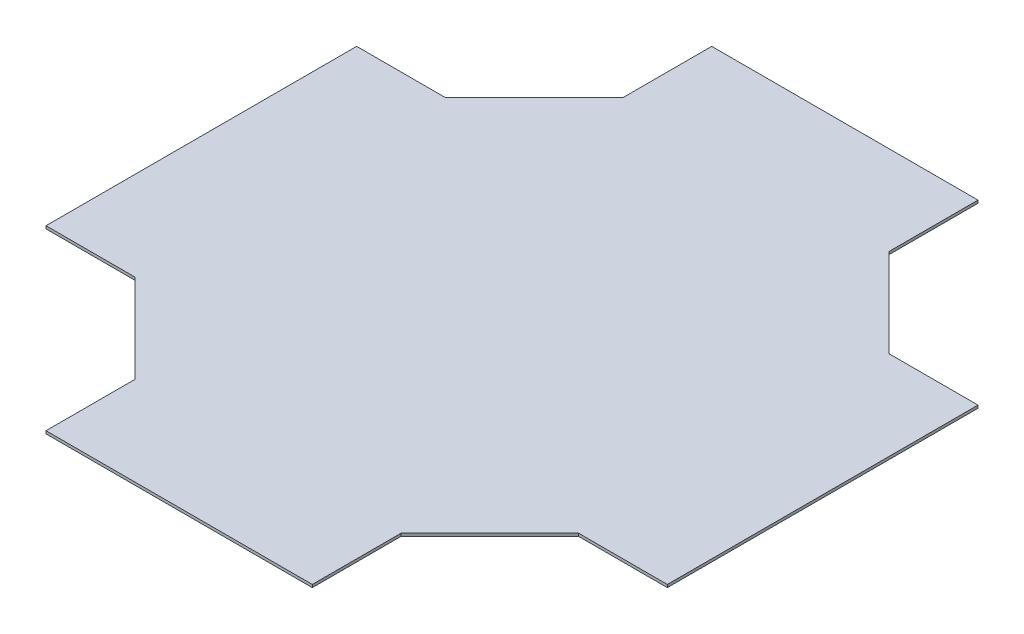
ISO-10303-21;
HEADER;
FILE_DESCRIPTION(('STEP AP214'),'2;1');
FILE_NAME('part.step','',(''),(''),'','','');
FILE_SCHEMA(('AUTOMOTIVE_DESIGN { 1 0 10303 214 1 1 1 1 }'));
ENDSEC;
DATA;
#1=APPLICATION_CONTEXT('core data for automotive mechanical design processes');
#2=APPLICATION_PROTOCOL_DEFINITION('international standard','automotive_design',2000,#1);
#3=PRODUCT_CONTEXT('',#1,'mechanical');
#4=PRODUCT('Part','Part','',(#3));
#5=PRODUCT_RELATED_PRODUCT_CATEGORY('part','',(#4));
#6=PRODUCT_DEFINITION_FORMATION('','',#4);
#7=PRODUCT_DEFINITION_CONTEXT('part definition',#1,'design');
#8=PRODUCT_DEFINITION('design','',#6,#7);
#9=PRODUCT_DEFINITION_SHAPE('','',#8);
#10=(LENGTH_UNIT() NAMED_UNIT(*) SI_UNIT(.MILLI.,.METRE.));
#11=(NAMED_UNIT(*) PLANE_ANGLE_UNIT() SI_UNIT($,.RADIAN.));
#12=(NAMED_UNIT(*) SI_UNIT($,.STERADIAN.) SOLID_ANGLE_UNIT());
#13=UNCERTAINTY_MEASURE_WITH_UNIT(LENGTH_MEASURE(1.E-05),#10,'distance_accuracy_value','');
#14=(GEOMETRIC_REPRESENTATION_CONTEXT(3) GLOBAL_UNCERTAINTY_ASSIGNED_CONTEXT((#13)) GLOBAL_UNIT_ASSIGNED_CONTEXT((#10,
#11,#12)) REPRESENTATION_CONTEXT('',''));
#15=CARTESIAN_POINT('',(0.,0.,0.));
#16=DIRECTION('',(0.,0.,1.));
#17=DIRECTION('',(1.,0.,0.));
#18=AXIS2_PLACEMENT_3D('',#15,#16,#17);
#19=CARTESIAN_POINT('',(0.,1.5875,-177.8));
#20=DIRECTION('',(0.,0.,-1.));
#21=DIRECTION('',(-1.,0.,0.));
#22=AXIS2_PLACEMENT_3D('',#19,#20,#21);
#23=PLANE('',#22);
#24=DIRECTION('',(1.,0.,0.));
#25=VECTOR('',#24,1.);
#26=CARTESIAN_POINT('',(0.,-1.5875,-177.8));
#27=LINE('',#26,#25);
#28=CARTESIAN_POINT('',(254.,-1.5875,-177.8));
#29=VERTEX_POINT('',#28);
#30=CARTESIAN_POINT('',(355.6,-1.5875,-177.8));
#31=VERTEX_POINT('',#30);
#32=EDGE_CURVE('E191',#29,#31,#27,.T.);
#33=ORIENTED_EDGE('',*,*,#32,.F.);
#34=DIRECTION('',(0.,-1.,0.));
#35=VECTOR('',#34,1.);
#36=CARTESIAN_POINT('',(254.,1.5875,-177.8));
#37=LINE('',#36,#35);
#38=CARTESIAN_POINT('',(254.,1.5875,-177.8));
#39=VERTEX_POINT('',#38);
#40=EDGE_CURVE('E11',#39,#29,#37,.T.);
#41=ORIENTED_EDGE('',*,*,#40,.F.);
#42=DIRECTION('',(1.,0.,0.));
#43=VECTOR('',#42,1.);
#44=CARTESIAN_POINT('',(0.,1.5875,-177.8));
#45=LINE('',#44,#43);
#46=CARTESIAN_POINT('',(355.6,1.5875,-177.8));
#47=VERTEX_POINT('',#46);
#48=EDGE_CURVE('E247',#39,#47,#45,.T.);
#49=ORIENTED_EDGE('',*,*,#48,.T.);
#50=DIRECTION('',(0.,-1.,0.));
#51=VECTOR('',#50,1.);
#52=CARTESIAN_POINT('',(355.6,1.5875,-177.8));
#53=LINE('',#52,#51);
#54=EDGE_CURVE('E58',#47,#31,#53,.T.);
#55=ORIENTED_EDGE('',*,*,#54,.T.);
#56=EDGE_LOOP('',(#33,#41,#49,#55));
#57=FACE_BOUND('',#56,.T.);
#58=ADVANCED_FACE('F41',(#57),#23,.T.);
#59=CARTESIAN_POINT('',(215.9,1.5875,-215.9));
#60=DIRECTION('',(-0.707106781186547,0.,0.707106781186548));
#61=DIRECTION('',(0.707106781186548,0.,0.707106781186547));
#62=AXIS2_PLACEMENT_3D('',#59,#60,#61);
#63=PLANE('',#62);
#64=DIRECTION('',(-0.707106781186548,0.,-0.707106781186547));
#65=VECTOR('',#64,1.);
#66=CARTESIAN_POINT('',(215.9,-1.5875,-215.9));
#67=LINE('',#66,#65);
#68=CARTESIAN_POINT('',(152.4,-1.5875,-279.4));
#69=VERTEX_POINT('',#68);
#70=EDGE_CURVE('E194',#29,#69,#67,.T.);
#71=ORIENTED_EDGE('',*,*,#70,.T.);
#72=DIRECTION('',(0.,-1.,0.));
#73=VECTOR('',#72,1.);
#74=CARTESIAN_POINT('',(152.4,1.5875,-279.4));
#75=LINE('',#74,#73);
#76=CARTESIAN_POINT('',(152.4,1.5875,-279.4));
#77=VERTEX_POINT('',#76);
#78=EDGE_CURVE('E50',#77,#69,#75,.T.);
#79=ORIENTED_EDGE('',*,*,#78,.F.);
#80=DIRECTION('',(-0.707106781186548,0.,-0.707106781186547));
#81=VECTOR('',#80,1.);
#82=CARTESIAN_POINT('',(215.9,1.5875,-215.9));
#83=LINE('',#82,#81);
#84=EDGE_CURVE('E316',#39,#77,#83,.T.);
#85=ORIENTED_EDGE('',*,*,#84,.F.);
#86=ORIENTED_EDGE('',*,*,#40,.T.);
#87=EDGE_LOOP('',(#71,#79,#85,#86));
#88=FACE_BOUND('',#87,.T.);
#89=ADVANCED_FACE('F362',(#88),#63,.F.);
#90=CARTESIAN_POINT('',(152.4,1.5875,0.));
#91=DIRECTION('',(-1.,0.,0.));
#92=DIRECTION('',(0.,0.,1.));
#93=AXIS2_PLACEMENT_3D('',#90,#91,#92);
#94=PLANE('',#93);
#95=DIRECTION('',(0.,0.,-1.));
#96=VECTOR('',#95,1.);
#97=CARTESIAN_POINT('',(152.4,-1.5875,0.));
#98=LINE('',#97,#96);
#99=CARTESIAN_POINT('',(152.4,-1.5875,-381.));
#100=VERTEX_POINT('',#99);
#101=EDGE_CURVE('E197',#69,#100,#98,.T.);
#102=ORIENTED_EDGE('',*,*,#101,.T.);
#103=DIRECTION('',(0.,-1.,0.));
#104=VECTOR('',#103,1.);
#105=CARTESIAN_POINT('',(152.4,1.5875,-381.));
#106=LINE('',#105,#104);
#107=CARTESIAN_POINT('',(152.4,1.5875,-381.));
#108=VERTEX_POINT('',#107);
#109=EDGE_CURVE('E283',#108,#100,#106,.T.);
#110=ORIENTED_EDGE('',*,*,#109,.F.);
#111=DIRECTION('',(0.,0.,-1.));
#112=VECTOR('',#111,1.);
#113=CARTESIAN_POINT('',(152.4,1.5875,0.));
#114=LINE('',#113,#112);
#115=EDGE_CURVE('E294',#77,#108,#114,.T.);
#116=ORIENTED_EDGE('',*,*,#115,.F.);
#117=ORIENTED_EDGE('',*,*,#78,.T.);
#118=EDGE_LOOP('',(#102,#110,#116,#117));
#119=FACE_BOUND('',#118,.T.);
#120=ADVANCED_FACE('F292',(#119),#94,.F.);
#121=CARTESIAN_POINT('',(0.,1.5875,-381.));
#122=DIRECTION('',(0.,0.,1.));
#123=DIRECTION('',(1.,0.,0.));
#124=AXIS2_PLACEMENT_3D('',#121,#122,#123);
#125=PLANE('',#124);
#126=DIRECTION('',(-1.,0.,0.));
#127=VECTOR('',#126,1.);
#128=CARTESIAN_POINT('',(0.,-1.5875,-381.));
#129=LINE('',#128,#127);
#130=CARTESIAN_POINT('',(-152.4,-1.5875,-381.));
#131=VERTEX_POINT('',#130);
#132=EDGE_CURVE('E200',#100,#131,#129,.T.);
#133=ORIENTED_EDGE('',*,*,#132,.T.);
#134=DIRECTION('',(0.,-1.,0.));
#135=VECTOR('',#134,1.);
#136=CARTESIAN_POINT('',(-152.4,1.5875,-381.));
#137=LINE('',#136,#135);
#138=CARTESIAN_POINT('',(-152.4,1.5875,-381.));
#139=VERTEX_POINT('',#138);
#140=EDGE_CURVE('E280',#139,#131,#137,.T.);
#141=ORIENTED_EDGE('',*,*,#140,.F.);
#142=DIRECTION('',(-1.,0.,0.));
#143=VECTOR('',#142,1.);
#144=CARTESIAN_POINT('',(0.,1.5875,-381.));
#145=LINE('',#144,#143);
#146=EDGE_CURVE('E307',#108,#139,#145,.T.);
#147=ORIENTED_EDGE('',*,*,#146,.F.);
#148=ORIENTED_EDGE('',*,*,#109,.T.);
#149=EDGE_LOOP('',(#133,#141,#147,#148));
#150=FACE_BOUND('',#149,.T.);
#151=ADVANCED_FACE('F304',(#150),#125,.F.);
#152=CARTESIAN_POINT('',(-152.4,1.5875,0.));
#153=DIRECTION('',(-1.,0.,0.));
#154=DIRECTION('',(0.,0.,1.));
#155=AXIS2_PLACEMENT_3D('',#152,#153,#154);
#156=PLANE('',#155);
#157=DIRECTION('',(0.,0.,-1.));
#158=VECTOR('',#157,1.);
#159=CARTESIAN_POINT('',(-152.4,-1.5875,0.));
#160=LINE('',#159,#158);
#161=CARTESIAN_POINT('',(-152.4,-1.5875,-279.4));
#162=VERTEX_POINT('',#161);
#163=EDGE_CURVE('E204',#162,#131,#160,.T.);
#164=ORIENTED_EDGE('',*,*,#163,.F.);
#165=DIRECTION('',(0.,-1.,0.));
#166=VECTOR('',#165,1.);
#167=CARTESIAN_POINT('',(-152.4,1.5875,-279.4));
#168=LINE('',#167,#166);
#169=CARTESIAN_POINT('',(-152.4,1.5875,-279.4));
#170=VERTEX_POINT('',#169);
#171=EDGE_CURVE('E277',#170,#162,#168,.T.);
#172=ORIENTED_EDGE('',*,*,#171,.F.);
#173=DIRECTION('',(0.,0.,-1.));
#174=VECTOR('',#173,1.);
#175=CARTESIAN_POINT('',(-152.4,1.5875,0.));
#176=LINE('',#175,#174);
#177=EDGE_CURVE('E310',#170,#139,#176,.T.);
#178=ORIENTED_EDGE('',*,*,#177,.T.);
#179=ORIENTED_EDGE('',*,*,#140,.T.);
#180=EDGE_LOOP('',(#164,#172,#178,#179));
#181=FACE_BOUND('',#180,.T.);
#182=ADVANCED_FACE('F470',(#181),#156,.T.);
#183=CARTESIAN_POINT('',(-215.9,1.5875,-215.9));
#184=DIRECTION('',(0.707106781186548,0.,0.707106781186547));
#185=DIRECTION('',(0.707106781186547,0.,-0.707106781186548));
#186=AXIS2_PLACEMENT_3D('',#183,#184,#185);
#187=PLANE('',#186);
#188=DIRECTION('',(-0.707106781186547,0.,0.707106781186548));
#189=VECTOR('',#188,1.);
#190=CARTESIAN_POINT('',(-215.9,-1.5875,-215.9));
#191=LINE('',#190,#189);
#192=CARTESIAN_POINT('',(-254.,-1.5875,-177.8));
#193=VERTEX_POINT('',#192);
#194=EDGE_CURVE('E208',#162,#193,#191,.T.);
#195=ORIENTED_EDGE('',*,*,#194,.T.);
#196=DIRECTION('',(0.,-1.,0.));
#197=VECTOR('',#196,1.);
#198=CARTESIAN_POINT('',(-254.,1.5875,-177.8));
#199=LINE('',#198,#197);
#200=CARTESIAN_POINT('',(-254.,1.5875,-177.8));
#201=VERTEX_POINT('',#200);
#202=EDGE_CURVE('E274',#201,#193,#199,.T.);
#203=ORIENTED_EDGE('',*,*,#202,.F.);
#204=DIRECTION('',(-0.707106781186547,0.,0.707106781186548));
#205=VECTOR('',#204,1.);
#206=CARTESIAN_POINT('',(-215.9,1.5875,-215.9));
#207=LINE('',#206,#205);
#208=EDGE_CURVE('E314',#170,#201,#207,.T.);
#209=ORIENTED_EDGE('',*,*,#208,.F.);
#210=ORIENTED_EDGE('',*,*,#171,.T.);
#211=EDGE_LOOP('',(#195,#203,#209,#210));
#212=FACE_BOUND('',#211,.T.);
#213=ADVANCED_FACE('F460',(#212),#187,.F.);
#214=CARTESIAN_POINT('',(0.,1.5875,-177.8));
#215=DIRECTION('',(0.,0.,-1.));
#216=DIRECTION('',(-1.,0.,0.));
#217=AXIS2_PLACEMENT_3D('',#214,#215,#216);
#218=PLANE('',#217);
#219=DIRECTION('',(1.,0.,0.));
#220=VECTOR('',#219,1.);
#221=CARTESIAN_POINT('',(0.,-1.5875,-177.8));
#222=LINE('',#221,#220);
#223=CARTESIAN_POINT('',(-355.6,-1.5875,-177.8));
#224=VERTEX_POINT('',#223);
#225=EDGE_CURVE('E212',#224,#193,#222,.T.);
#226=ORIENTED_EDGE('',*,*,#225,.F.);
#227=DIRECTION('',(0.,-1.,0.));
#228=VECTOR('',#227,1.);
#229=CARTESIAN_POINT('',(-355.6,1.5875,-177.8));
#230=LINE('',#229,#228);
#231=CARTESIAN_POINT('',(-355.6,1.5875,-177.8));
#232=VERTEX_POINT('',#231);
#233=EDGE_CURVE('E271',#232,#224,#230,.T.);
#234=ORIENTED_EDGE('',*,*,#233,.F.);
#235=DIRECTION('',(1.,0.,0.));
#236=VECTOR('',#235,1.);
#237=CARTESIAN_POINT('',(0.,1.5875,-177.8));
#238=LINE('',#237,#236);
#239=EDGE_CURVE('E322',#232,#201,#238,.T.);
#240=ORIENTED_EDGE('',*,*,#239,.T.);
#241=ORIENTED_EDGE('',*,*,#202,.T.);
#242=EDGE_LOOP('',(#226,#234,#240,#241));
#243=FACE_BOUND('',#242,.T.);
#244=ADVANCED_FACE('F450',(#243),#218,.T.);
#245=CARTESIAN_POINT('',(-355.6,1.5875,0.));
#246=DIRECTION('',(1.,0.,0.));
#247=DIRECTION('',(0.,0.,-1.));
#248=AXIS2_PLACEMENT_3D('',#245,#246,#247);
#249=PLANE('',#248);
#250=DIRECTION('',(0.,0.,1.));
#251=VECTOR('',#250,1.);
#252=CARTESIAN_POINT('',(-355.6,-1.5875,0.));
#253=LINE('',#252,#251);
#254=CARTESIAN_POINT('',(-355.6,-1.5875,177.8));
#255=VERTEX_POINT('',#254);
#256=EDGE_CURVE('E216',#224,#255,#253,.T.);
#257=ORIENTED_EDGE('',*,*,#256,.T.);
#258=DIRECTION('',(0.,-1.,0.));
#259=VECTOR('',#258,1.);
#260=CARTESIAN_POINT('',(-355.6,1.5875,177.8));
#261=LINE('',#260,#259);
#262=CARTESIAN_POINT('',(-355.6,1.5875,177.8));
#263=VERTEX_POINT('',#262);
#264=EDGE_CURVE('E267',#263,#255,#261,.T.);
#265=ORIENTED_EDGE('',*,*,#264,.F.);
#266=DIRECTION('',(0.,0.,1.));
#267=VECTOR('',#266,1.);
#268=CARTESIAN_POINT('',(-355.6,1.5875,0.));
#269=LINE('',#268,#267);
#270=EDGE_CURVE('E326',#232,#263,#269,.T.);
#271=ORIENTED_EDGE('',*,*,#270,.F.);
#272=ORIENTED_EDGE('',*,*,#233,.T.);
#273=EDGE_LOOP('',(#257,#265,#271,#272));
#274=FACE_BOUND('',#273,.T.);
#275=ADVANCED_FACE('F440',(#274),#249,.F.);
#276=CARTESIAN_POINT('',(0.,1.5875,177.8));
#277=DIRECTION('',(0.,0.,-1.));
#278=DIRECTION('',(-1.,0.,0.));
#279=AXIS2_PLACEMENT_3D('',#276,#277,#278);
#280=PLANE('',#279);
#281=DIRECTION('',(1.,0.,0.));
#282=VECTOR('',#281,1.);
#283=CARTESIAN_POINT('',(0.,-1.5875,177.8));
#284=LINE('',#283,#282);
#285=CARTESIAN_POINT('',(-254.,-1.5875,177.8));
#286=VERTEX_POINT('',#285);
#287=EDGE_CURVE('E219',#255,#286,#284,.T.);
#288=ORIENTED_EDGE('',*,*,#287,.T.);
#289=DIRECTION('',(0.,-1.,0.));
#290=VECTOR('',#289,1.);
#291=CARTESIAN_POINT('',(-254.,1.5875,177.8));
#292=LINE('',#291,#290);
#293=CARTESIAN_POINT('',(-254.,1.5875,177.8));
#294=VERTEX_POINT('',#293);
#295=EDGE_CURVE('E263',#294,#286,#292,.T.);
#296=ORIENTED_EDGE('',*,*,#295,.F.);
#297=DIRECTION('',(1.,0.,0.));
#298=VECTOR('',#297,1.);
#299=CARTESIAN_POINT('',(0.,1.5875,177.8));
#300=LINE('',#299,#298);
#301=EDGE_CURVE('E329',#263,#294,#300,.T.);
#302=ORIENTED_EDGE('',*,*,#301,.F.);
#303=ORIENTED_EDGE('',*,*,#264,.T.);
#304=EDGE_LOOP('',(#288,#296,#302,#303));
#305=FACE_BOUND('',#304,.T.);
#306=ADVANCED_FACE('F430',(#305),#280,.F.);
#307=CARTESIAN_POINT('',(-215.9,1.5875,215.9));
#308=DIRECTION('',(0.707106781186548,0.,-0.707106781186548));
#309=DIRECTION('',(-0.707106781186548,0.,-0.707106781186548));
#310=AXIS2_PLACEMENT_3D('',#307,#308,#309);
#311=PLANE('',#310);
#312=DIRECTION('',(0.707106781186548,0.,0.707106781186548));
#313=VECTOR('',#312,1.);
#314=CARTESIAN_POINT('',(-215.9,-1.5875,215.9));
#315=LINE('',#314,#313);
#316=CARTESIAN_POINT('',(-152.4,-1.5875,279.4));
#317=VERTEX_POINT('',#316);
#318=EDGE_CURVE('E222',#286,#317,#315,.T.);
#319=ORIENTED_EDGE('',*,*,#318,.T.);
#320=DIRECTION('',(0.,-1.,0.));
#321=VECTOR('',#320,1.);
#322=CARTESIAN_POINT('',(-152.4,1.5875,279.4));
#323=LINE('',#322,#321);
#324=CARTESIAN_POINT('',(-152.4,1.5875,279.4));
#325=VERTEX_POINT('',#324);
#326=EDGE_CURVE('E260',#325,#317,#323,.T.);
#327=ORIENTED_EDGE('',*,*,#326,.F.);
#328=DIRECTION('',(0.707106781186548,0.,0.707106781186548));
#329=VECTOR('',#328,1.);
#330=CARTESIAN_POINT('',(-215.9,1.5875,215.9));
#331=LINE('',#330,#329);
#332=EDGE_CURVE('E332',#294,#325,#331,.T.);
#333=ORIENTED_EDGE('',*,*,#332,.F.);
#334=ORIENTED_EDGE('',*,*,#295,.T.);
#335=EDGE_LOOP('',(#319,#327,#333,#334));
#336=FACE_BOUND('',#335,.T.);
#337=ADVANCED_FACE('F421',(#336),#311,.F.);
#338=CARTESIAN_POINT('',(-152.4,1.5875,0.));
#339=DIRECTION('',(-1.,0.,0.));
#340=DIRECTION('',(0.,0.,1.));
#341=AXIS2_PLACEMENT_3D('',#338,#339,#340);
#342=PLANE('',#341);
#343=DIRECTION('',(0.,0.,-1.));
#344=VECTOR('',#343,1.);
#345=CARTESIAN_POINT('',(-152.4,-1.5875,0.));
#346=LINE('',#345,#344);
#347=CARTESIAN_POINT('',(-152.4,-1.5875,381.));
#348=VERTEX_POINT('',#347);
#349=EDGE_CURVE('E226',#348,#317,#346,.T.);
#350=ORIENTED_EDGE('',*,*,#349,.F.);
#351=DIRECTION('',(0.,-1.,0.));
#352=VECTOR('',#351,1.);
#353=CARTESIAN_POINT('',(-152.4,1.5875,381.));
#354=LINE('',#353,#352);
#355=CARTESIAN_POINT('',(-152.4,1.5875,381.));
#356=VERTEX_POINT('',#355);
#357=EDGE_CURVE('E257',#356,#348,#354,.T.);
#358=ORIENTED_EDGE('',*,*,#357,.F.);
#359=DIRECTION('',(0.,0.,-1.));
#360=VECTOR('',#359,1.);
#361=CARTESIAN_POINT('',(-152.4,1.5875,0.));
#362=LINE('',#361,#360);
#363=EDGE_CURVE('E335',#356,#325,#362,.T.);
#364=ORIENTED_EDGE('',*,*,#363,.T.);
#365=ORIENTED_EDGE('',*,*,#326,.T.);
#366=EDGE_LOOP('',(#350,#358,#364,#365));
#367=FACE_BOUND('',#366,.T.);
#368=ADVANCED_FACE('F348',(#367),#342,.T.);
#369=CARTESIAN_POINT('',(1.38777878078145E-13,1.5875,381.));
#370=DIRECTION('',(0.,0.,1.));
#371=DIRECTION('',(1.,0.,0.));
#372=AXIS2_PLACEMENT_3D('',#369,#370,#371);
#373=PLANE('',#372);
#374=DIRECTION('',(-1.,0.,0.));
#375=VECTOR('',#374,1.);
#376=CARTESIAN_POINT('',(1.38777878078145E-13,-1.5875,381.));
#377=LINE('',#376,#375);
#378=CARTESIAN_POINT('',(152.4,-1.5875,381.));
#379=VERTEX_POINT('',#378);
#380=EDGE_CURVE('E230',#379,#348,#377,.T.);
#381=ORIENTED_EDGE('',*,*,#380,.F.);
#382=DIRECTION('',(0.,-1.,0.));
#383=VECTOR('',#382,1.);
#384=CARTESIAN_POINT('',(152.4,1.5875,381.));
#385=LINE('',#384,#383);
#386=CARTESIAN_POINT('',(152.4,1.5875,381.));
#387=VERTEX_POINT('',#386);
#388=EDGE_CURVE('E254',#387,#379,#385,.T.);
#389=ORIENTED_EDGE('',*,*,#388,.F.);
#390=DIRECTION('',(-1.,0.,0.));
#391=VECTOR('',#390,1.);
#392=CARTESIAN_POINT('',(1.38777878078145E-13,1.5875,381.));
#393=LINE('',#392,#391);
#394=EDGE_CURVE('E185',#387,#356,#393,.T.);
#395=ORIENTED_EDGE('',*,*,#394,.T.);
#396=ORIENTED_EDGE('',*,*,#357,.T.);
#397=EDGE_LOOP('',(#381,#389,#395,#396));
#398=FACE_BOUND('',#397,.T.);
#399=ADVANCED_FACE('F342',(#398),#373,.T.);
#400=CARTESIAN_POINT('',(152.4,1.5875,0.));
#401=DIRECTION('',(-1.,0.,0.));
#402=DIRECTION('',(0.,0.,1.));
#403=AXIS2_PLACEMENT_3D('',#400,#401,#402);
#404=PLANE('',#403);
#405=DIRECTION('',(0.,0.,-1.));
#406=VECTOR('',#405,1.);
#407=CARTESIAN_POINT('',(152.4,-1.5875,0.));
#408=LINE('',#407,#406);
#409=CARTESIAN_POINT('',(152.4,-1.5875,279.4));
#410=VERTEX_POINT('',#409);
#411=EDGE_CURVE('E234',#379,#410,#408,.T.);
#412=ORIENTED_EDGE('',*,*,#411,.T.);
#413=DIRECTION('',(0.,-1.,0.));
#414=VECTOR('',#413,1.);
#415=CARTESIAN_POINT('',(152.4,1.5875,279.4));
#416=LINE('',#415,#414);
#417=CARTESIAN_POINT('',(152.4,1.5875,279.4));
#418=VERTEX_POINT('',#417);
#419=EDGE_CURVE('E167',#418,#410,#416,.T.);
#420=ORIENTED_EDGE('',*,*,#419,.F.);
#421=DIRECTION('',(0.,0.,-1.));
#422=VECTOR('',#421,1.);
#423=CARTESIAN_POINT('',(152.4,1.5875,0.));
#424=LINE('',#423,#422);
#425=EDGE_CURVE('E180',#387,#418,#424,.T.);
#426=ORIENTED_EDGE('',*,*,#425,.F.);
#427=ORIENTED_EDGE('',*,*,#388,.T.);
#428=EDGE_LOOP('',(#412,#420,#426,#427));
#429=FACE_BOUND('',#428,.T.);
#430=ADVANCED_FACE('F352',(#429),#404,.F.);
#431=CARTESIAN_POINT('',(215.9,1.5875,215.9));
#432=DIRECTION('',(0.707106781186547,0.,0.707106781186548));
#433=DIRECTION('',(0.707106781186548,0.,-0.707106781186547));
#434=AXIS2_PLACEMENT_3D('',#431,#432,#433);
#435=PLANE('',#434);
#436=DIRECTION('',(-0.707106781186548,0.,0.707106781186547));
#437=VECTOR('',#436,1.);
#438=CARTESIAN_POINT('',(215.9,-1.5875,215.9));
#439=LINE('',#438,#437);
#440=CARTESIAN_POINT('',(254.,-1.5875,177.8));
#441=VERTEX_POINT('',#440);
#442=EDGE_CURVE('E163',#441,#410,#439,.T.);
#443=ORIENTED_EDGE('',*,*,#442,.F.);
#444=DIRECTION('',(0.,-1.,0.));
#445=VECTOR('',#444,1.);
#446=CARTESIAN_POINT('',(254.,1.5875,177.8));
#447=LINE('',#446,#445);
#448=CARTESIAN_POINT('',(254.,1.5875,177.8));
#449=VERTEX_POINT('',#448);
#450=EDGE_CURVE('E157',#449,#441,#447,.T.);
#451=ORIENTED_EDGE('',*,*,#450,.F.);
#452=DIRECTION('',(-0.707106781186548,0.,0.707106781186547));
#453=VECTOR('',#452,1.);
#454=CARTESIAN_POINT('',(215.9,1.5875,215.9));
#455=LINE('',#454,#453);
#456=EDGE_CURVE('E161',#449,#418,#455,.T.);
#457=ORIENTED_EDGE('',*,*,#456,.T.);
#458=ORIENTED_EDGE('',*,*,#419,.T.);
#459=EDGE_LOOP('',(#443,#451,#457,#458));
#460=FACE_BOUND('',#459,.T.);
#461=ADVANCED_FACE('F159',(#460),#435,.T.);
#462=CARTESIAN_POINT('',(0.,1.5875,177.8));
#463=DIRECTION('',(0.,0.,-1.));
#464=DIRECTION('',(-1.,0.,0.));
#465=AXIS2_PLACEMENT_3D('',#462,#463,#464);
#466=PLANE('',#465);
#467=DIRECTION('',(1.,0.,0.));
#468=VECTOR('',#467,1.);
#469=CARTESIAN_POINT('',(0.,-1.5875,177.8));
#470=LINE('',#469,#468);
#471=CARTESIAN_POINT('',(355.6,-1.5875,177.8));
#472=VERTEX_POINT('',#471);
#473=EDGE_CURVE('E240',#441,#472,#470,.T.);
#474=ORIENTED_EDGE('',*,*,#473,.T.);
#475=DIRECTION('',(0.,-1.,0.));
#476=VECTOR('',#475,1.);
#477=CARTESIAN_POINT('',(355.6,1.5875,177.8));
#478=LINE('',#477,#476);
#479=CARTESIAN_POINT('',(355.6,1.5875,177.8));
#480=VERTEX_POINT('',#479);
#481=EDGE_CURVE('E108',#480,#472,#478,.T.);
#482=ORIENTED_EDGE('',*,*,#481,.F.);
#483=DIRECTION('',(1.,0.,0.));
#484=VECTOR('',#483,1.);
#485=CARTESIAN_POINT('',(0.,1.5875,177.8));
#486=LINE('',#485,#484);
#487=EDGE_CURVE('E169',#449,#480,#486,.T.);
#488=ORIENTED_EDGE('',*,*,#487,.F.);
#489=ORIENTED_EDGE('',*,*,#450,.T.);
#490=EDGE_LOOP('',(#474,#482,#488,#489));
#491=FACE_BOUND('',#490,.T.);
#492=ADVANCED_FACE('F170',(#491),#466,.F.);
#493=CARTESIAN_POINT('',(355.6,1.5875,0.));
#494=DIRECTION('',(1.,0.,0.));
#495=DIRECTION('',(0.,0.,-1.));
#496=AXIS2_PLACEMENT_3D('',#493,#494,#495);
#497=PLANE('',#496);
#498=DIRECTION('',(0.,0.,1.));
#499=VECTOR('',#498,1.);
#500=CARTESIAN_POINT('',(355.6,-1.5875,0.));
#501=LINE('',#500,#499);
#502=EDGE_CURVE('E243',#31,#472,#501,.T.);
#503=ORIENTED_EDGE('',*,*,#502,.F.);
#504=ORIENTED_EDGE('',*,*,#54,.F.);
#505=DIRECTION('',(0.,0.,1.));
#506=VECTOR('',#505,1.);
#507=CARTESIAN_POINT('',(355.6,1.5875,0.));
#508=LINE('',#507,#506);
#509=EDGE_CURVE('E174',#47,#480,#508,.T.);
#510=ORIENTED_EDGE('',*,*,#509,.T.);
#511=ORIENTED_EDGE('',*,*,#481,.T.);
#512=EDGE_LOOP('',(#503,#504,#510,#511));
#513=FACE_BOUND('',#512,.T.);
#514=ADVANCED_FACE('F366',(#513),#497,.T.);
#515=CARTESIAN_POINT('',(0.,1.5875,0.));
#516=DIRECTION('',(0.,1.,0.));
#517=DIRECTION('',(0.,0.,1.));
#518=AXIS2_PLACEMENT_3D('',#515,#516,#517);
#519=PLANE('',#518);
#520=ORIENTED_EDGE('',*,*,#48,.F.);
#521=ORIENTED_EDGE('',*,*,#84,.T.);
#522=ORIENTED_EDGE('',*,*,#115,.T.);
#523=ORIENTED_EDGE('',*,*,#146,.T.);
#524=ORIENTED_EDGE('',*,*,#177,.F.);
#525=ORIENTED_EDGE('',*,*,#208,.T.);
#526=ORIENTED_EDGE('',*,*,#239,.F.);
#527=ORIENTED_EDGE('',*,*,#270,.T.);
#528=ORIENTED_EDGE('',*,*,#301,.T.);
#529=ORIENTED_EDGE('',*,*,#332,.T.);
#530=ORIENTED_EDGE('',*,*,#363,.F.);
#531=ORIENTED_EDGE('',*,*,#394,.F.);
#532=ORIENTED_EDGE('',*,*,#425,.T.);
#533=ORIENTED_EDGE('',*,*,#456,.F.);
#534=ORIENTED_EDGE('',*,*,#487,.T.);
#535=ORIENTED_EDGE('',*,*,#509,.F.);
#536=EDGE_LOOP('',(#520,#521,#522,#523,#524,#525,#526,#527,#528,#529,#530,#531,#532,#533,#534,#535));
#537=FACE_BOUND('',#536,.T.);
#538=ADVANCED_FACE('F177',(#537),#519,.T.);
#539=CARTESIAN_POINT('',(0.,-1.5875,0.));
#540=DIRECTION('',(0.,1.,0.));
#541=DIRECTION('',(0.,0.,1.));
#542=AXIS2_PLACEMENT_3D('',#539,#540,#541);
#543=PLANE('',#542);
#544=ORIENTED_EDGE('',*,*,#32,.T.);
#545=ORIENTED_EDGE('',*,*,#502,.T.);
#546=ORIENTED_EDGE('',*,*,#473,.F.);
#547=ORIENTED_EDGE('',*,*,#442,.T.);
#548=ORIENTED_EDGE('',*,*,#411,.F.);
#549=ORIENTED_EDGE('',*,*,#380,.T.);
#550=ORIENTED_EDGE('',*,*,#349,.T.);
#551=ORIENTED_EDGE('',*,*,#318,.F.);
#552=ORIENTED_EDGE('',*,*,#287,.F.);
#553=ORIENTED_EDGE('',*,*,#256,.F.);
#554=ORIENTED_EDGE('',*,*,#225,.T.);
#555=ORIENTED_EDGE('',*,*,#194,.F.);
#556=ORIENTED_EDGE('',*,*,#163,.T.);
#557=ORIENTED_EDGE('',*,*,#132,.F.);
#558=ORIENTED_EDGE('',*,*,#101,.F.);
#559=ORIENTED_EDGE('',*,*,#70,.F.);
#560=EDGE_LOOP('',(#544,#545,#546,#547,#548,#549,#550,#551,#552,#553,#554,#555,#556,#557,#558,#559));
#561=FACE_BOUND('',#560,.T.);
#562=ADVANCED_FACE('F299',(#561),#543,.F.);
#563=CLOSED_SHELL('',(#58,#89,#120,#151,#182,#213,#244,#275,#306,#337,#368,#399,#430,#461,#492,
#514,#538,#562));
#564=MANIFOLD_SOLID_BREP('B2',#563);
#565=ADVANCED_BREP_SHAPE_REPRESENTATION('',(#18,#564),#14);
#566=SHAPE_DEFINITION_REPRESENTATION(#9,#565);
ENDSEC;
END-ISO-10303-21;
